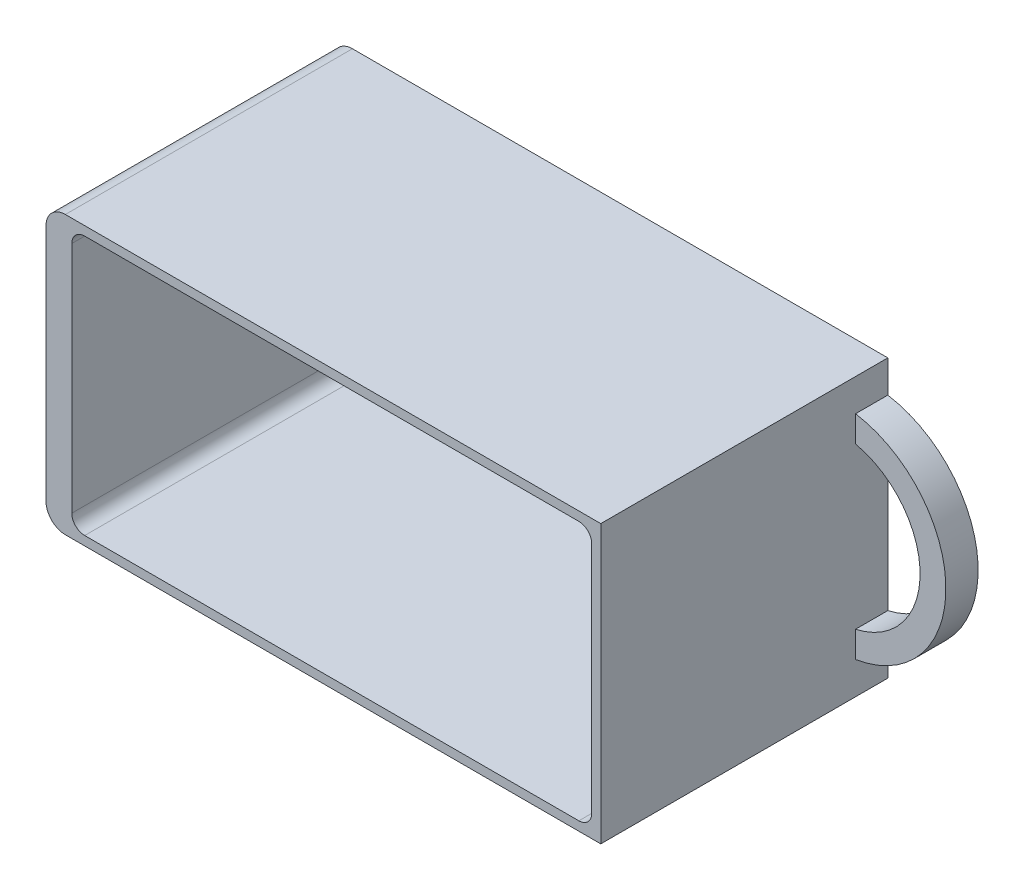
ISO-10303-21;
HEADER;
FILE_DESCRIPTION(('STEP AP214'),'2;1');
FILE_NAME('part.step','',(''),(''),'','','');
FILE_SCHEMA(('AUTOMOTIVE_DESIGN { 1 0 10303 214 1 1 1 1 }'));
ENDSEC;
DATA;
#1=APPLICATION_CONTEXT('core data for automotive mechanical design processes');
#2=APPLICATION_PROTOCOL_DEFINITION('international standard','automotive_design',2000,#1);
#3=PRODUCT_CONTEXT('',#1,'mechanical');
#4=PRODUCT('Part','Part','',(#3));
#5=PRODUCT_RELATED_PRODUCT_CATEGORY('part','',(#4));
#6=PRODUCT_DEFINITION_FORMATION('','',#4);
#7=PRODUCT_DEFINITION_CONTEXT('part definition',#1,'design');
#8=PRODUCT_DEFINITION('design','',#6,#7);
#9=PRODUCT_DEFINITION_SHAPE('','',#8);
#10=(LENGTH_UNIT() NAMED_UNIT(*) SI_UNIT(.MILLI.,.METRE.));
#11=(NAMED_UNIT(*) PLANE_ANGLE_UNIT() SI_UNIT($,.RADIAN.));
#12=(NAMED_UNIT(*) SI_UNIT($,.STERADIAN.) SOLID_ANGLE_UNIT());
#13=UNCERTAINTY_MEASURE_WITH_UNIT(LENGTH_MEASURE(1.E-05),#10,'distance_accuracy_value','');
#14=(GEOMETRIC_REPRESENTATION_CONTEXT(3) GLOBAL_UNCERTAINTY_ASSIGNED_CONTEXT((#13)) GLOBAL_UNIT_ASSIGNED_CONTEXT((#10,
#11,#12)) REPRESENTATION_CONTEXT('',''));
#15=CARTESIAN_POINT('',(0.,0.,0.));
#16=DIRECTION('',(0.,0.,1.));
#17=DIRECTION('',(1.,0.,0.));
#18=AXIS2_PLACEMENT_3D('',#15,#16,#17);
#19=CARTESIAN_POINT('',(4.,-21.5,-17.25));
#20=DIRECTION('',(0.,-1.,0.));
#21=DIRECTION('',(0.,0.,-1.));
#22=AXIS2_PLACEMENT_3D('',#19,#20,#21);
#23=PLANE('',#22);
#24=DIRECTION('',(1.,0.,0.));
#25=VECTOR('',#24,1.);
#26=CARTESIAN_POINT('',(4.,-21.5,22.25));
#27=LINE('',#26,#25);
#28=CARTESIAN_POINT('',(7.,-21.5,22.25));
#29=VERTEX_POINT('',#28);
#30=CARTESIAN_POINT('',(90.,-21.5,22.25));
#31=VERTEX_POINT('',#30);
#32=EDGE_CURVE('E221',#29,#31,#27,.T.);
#33=ORIENTED_EDGE('',*,*,#32,.F.);
#34=DIRECTION('',(0.,0.,1.));
#35=VECTOR('',#34,1.);
#36=CARTESIAN_POINT('',(7.,-21.5,-17.25));
#37=LINE('',#36,#35);
#38=CARTESIAN_POINT('',(7.,-21.5,-22.25));
#39=VERTEX_POINT('',#38);
#40=EDGE_CURVE('E249',#29,#39,#37,.F.);
#41=ORIENTED_EDGE('',*,*,#40,.T.);
#42=DIRECTION('',(-1.,0.,0.));
#43=VECTOR('',#42,1.);
#44=CARTESIAN_POINT('',(4.,-21.5,-22.25));
#45=LINE('',#44,#43);
#46=CARTESIAN_POINT('',(90.0000000000001,-21.5,-22.25));
#47=VERTEX_POINT('',#46);
#48=EDGE_CURVE('E199',#47,#39,#45,.T.);
#49=ORIENTED_EDGE('',*,*,#48,.F.);
#50=DIRECTION('',(0.,0.,1.));
#51=VECTOR('',#50,1.);
#52=CARTESIAN_POINT('',(90.,-21.5,-17.25));
#53=LINE('',#52,#51);
#54=EDGE_CURVE('E238',#47,#31,#53,.T.);
#55=ORIENTED_EDGE('',*,*,#54,.T.);
#56=EDGE_LOOP('',(#33,#41,#49,#55));
#57=FACE_BOUND('',#56,.T.);
#58=ADVANCED_FACE('F34',(#57),#23,.T.);
#59=CARTESIAN_POINT('',(4.,21.5,-17.25));
#60=DIRECTION('',(-1.,0.,0.));
#61=DIRECTION('',(0.,0.,1.));
#62=AXIS2_PLACEMENT_3D('',#59,#60,#61);
#63=PLANE('',#62);
#64=DIRECTION('',(0.,1.,0.));
#65=VECTOR('',#64,1.);
#66=CARTESIAN_POINT('',(4.,21.5,-22.25));
#67=LINE('',#66,#65);
#68=CARTESIAN_POINT('',(4.,-18.5,-22.25));
#69=VERTEX_POINT('',#68);
#70=CARTESIAN_POINT('',(4.,18.5,-22.25));
#71=VERTEX_POINT('',#70);
#72=EDGE_CURVE('E202',#69,#71,#67,.T.);
#73=ORIENTED_EDGE('',*,*,#72,.F.);
#74=DIRECTION('',(0.,0.,1.));
#75=VECTOR('',#74,1.);
#76=CARTESIAN_POINT('',(4.,-18.5,-17.25));
#77=LINE('',#76,#75);
#78=CARTESIAN_POINT('',(4.,-18.5,22.25));
#79=VERTEX_POINT('',#78);
#80=EDGE_CURVE('E242',#69,#79,#77,.T.);
#81=ORIENTED_EDGE('',*,*,#80,.T.);
#82=DIRECTION('',(0.,-1.,0.));
#83=VECTOR('',#82,1.);
#84=CARTESIAN_POINT('',(4.,21.5,22.25));
#85=LINE('',#84,#83);
#86=CARTESIAN_POINT('',(4.,18.5,22.25));
#87=VERTEX_POINT('',#86);
#88=EDGE_CURVE('E225',#87,#79,#85,.T.);
#89=ORIENTED_EDGE('',*,*,#88,.F.);
#90=DIRECTION('',(0.,0.,1.));
#91=VECTOR('',#90,1.);
#92=CARTESIAN_POINT('',(4.,18.5,-17.25));
#93=LINE('',#92,#91);
#94=EDGE_CURVE('E237',#87,#71,#93,.F.);
#95=ORIENTED_EDGE('',*,*,#94,.T.);
#96=EDGE_LOOP('',(#73,#81,#89,#95));
#97=FACE_BOUND('',#96,.T.);
#98=ADVANCED_FACE('F379',(#97),#63,.T.);
#99=CARTESIAN_POINT('',(90.,21.5,-17.25));
#100=DIRECTION('',(0.,1.,0.));
#101=DIRECTION('',(0.,0.,1.));
#102=AXIS2_PLACEMENT_3D('',#99,#100,#101);
#103=PLANE('',#102);
#104=DIRECTION('',(1.,0.,0.));
#105=VECTOR('',#104,1.);
#106=CARTESIAN_POINT('',(90.,21.5,-22.25));
#107=LINE('',#106,#105);
#108=CARTESIAN_POINT('',(7.00000000000001,21.5,-22.25));
#109=VERTEX_POINT('',#108);
#110=CARTESIAN_POINT('',(90.,21.5,-22.25));
#111=VERTEX_POINT('',#110);
#112=EDGE_CURVE('E205',#109,#111,#107,.T.);
#113=ORIENTED_EDGE('',*,*,#112,.F.);
#114=DIRECTION('',(0.,0.,1.));
#115=VECTOR('',#114,1.);
#116=CARTESIAN_POINT('',(7.00000000000001,21.5,-17.25));
#117=LINE('',#116,#115);
#118=CARTESIAN_POINT('',(7.00000000000001,21.5,22.25));
#119=VERTEX_POINT('',#118);
#120=EDGE_CURVE('E255',#109,#119,#117,.T.);
#121=ORIENTED_EDGE('',*,*,#120,.T.);
#122=DIRECTION('',(-1.,0.,0.));
#123=VECTOR('',#122,1.);
#124=CARTESIAN_POINT('',(90.,21.5,22.25));
#125=LINE('',#124,#123);
#126=CARTESIAN_POINT('',(90.,21.5,22.25));
#127=VERTEX_POINT('',#126);
#128=EDGE_CURVE('E230',#127,#119,#125,.T.);
#129=ORIENTED_EDGE('',*,*,#128,.F.);
#130=DIRECTION('',(0.,0.,1.));
#131=VECTOR('',#130,1.);
#132=CARTESIAN_POINT('',(90.,21.5,-17.25));
#133=LINE('',#132,#131);
#134=EDGE_CURVE('E235',#111,#127,#133,.T.);
#135=ORIENTED_EDGE('',*,*,#134,.F.);
#136=EDGE_LOOP('',(#113,#121,#129,#135));
#137=FACE_BOUND('',#136,.T.);
#138=ADVANCED_FACE('F385',(#137),#103,.T.);
#139=CARTESIAN_POINT('',(90.,-21.5,-17.25));
#140=DIRECTION('',(1.,0.,0.));
#141=DIRECTION('',(0.,0.,-1.));
#142=AXIS2_PLACEMENT_3D('',#139,#140,#141);
#143=PLANE('',#142);
#144=DIRECTION('',(0.,1.,0.));
#145=VECTOR('',#144,1.);
#146=CARTESIAN_POINT('',(90.,-21.5,22.25));
#147=LINE('',#146,#145);
#148=EDGE_CURVE('E227',#31,#127,#147,.T.);
#149=ORIENTED_EDGE('',*,*,#148,.F.);
#150=ORIENTED_EDGE('',*,*,#54,.F.);
#151=DIRECTION('',(0.,-1.,0.));
#152=VECTOR('',#151,1.);
#153=CARTESIAN_POINT('',(90.0000000000001,-21.5,-22.25));
#154=LINE('',#153,#152);
#155=CARTESIAN_POINT('',(90.0000000000001,-16.5000000000007,-22.25));
#156=VERTEX_POINT('',#155);
#157=EDGE_CURVE('E211',#156,#47,#154,.T.);
#158=ORIENTED_EDGE('',*,*,#157,.F.);
#159=DIRECTION('',(0.,0.,1.));
#160=VECTOR('',#159,1.);
#161=CARTESIAN_POINT('',(90.0000000000001,-16.5000000000007,-22.25));
#162=LINE('',#161,#160);
#163=CARTESIAN_POINT('',(90.0000000000001,-16.5000000000007,-17.25));
#164=VERTEX_POINT('',#163);
#165=EDGE_CURVE('E214',#156,#164,#162,.T.);
#166=ORIENTED_EDGE('',*,*,#165,.T.);
#167=DIRECTION('',(0.,1.,0.));
#168=VECTOR('',#167,1.);
#169=CARTESIAN_POINT('',(90.,-21.5,-17.25));
#170=LINE('',#169,#168);
#171=CARTESIAN_POINT('',(90.,-12.4283661723616,-17.25));
#172=VERTEX_POINT('',#171);
#173=EDGE_CURVE('E224',#164,#172,#170,.T.);
#174=ORIENTED_EDGE('',*,*,#173,.T.);
#175=DIRECTION('',(0.,0.,1.));
#176=VECTOR('',#175,1.);
#177=CARTESIAN_POINT('',(90.,-12.4283661723616,-22.25));
#178=LINE('',#177,#176);
#179=CARTESIAN_POINT('',(90.,-12.4283661723616,-22.25));
#180=VERTEX_POINT('',#179);
#181=EDGE_CURVE('E178',#180,#172,#178,.T.);
#182=ORIENTED_EDGE('',*,*,#181,.F.);
#183=DIRECTION('',(0.,1.,0.));
#184=VECTOR('',#183,1.);
#185=CARTESIAN_POINT('',(90.,-12.4283661723616,-22.25));
#186=LINE('',#185,#184);
#187=CARTESIAN_POINT('',(90.,12.4283661723609,-22.25));
#188=VERTEX_POINT('',#187);
#189=EDGE_CURVE('E171',#180,#188,#186,.T.);
#190=ORIENTED_EDGE('',*,*,#189,.T.);
#191=DIRECTION('',(0.,0.,1.));
#192=VECTOR('',#191,1.);
#193=CARTESIAN_POINT('',(90.,12.4283661723609,-22.25));
#194=LINE('',#193,#192);
#195=CARTESIAN_POINT('',(90.,12.4283661723609,-17.25));
#196=VERTEX_POINT('',#195);
#197=EDGE_CURVE('E176',#188,#196,#194,.T.);
#198=ORIENTED_EDGE('',*,*,#197,.T.);
#199=CARTESIAN_POINT('',(90.,16.5,-17.25));
#200=VERTEX_POINT('',#199);
#201=EDGE_CURVE('E222',#196,#200,#170,.T.);
#202=ORIENTED_EDGE('',*,*,#201,.T.);
#203=DIRECTION('',(0.,0.,1.));
#204=VECTOR('',#203,1.);
#205=CARTESIAN_POINT('',(90.,16.5,-22.25));
#206=LINE('',#205,#204);
#207=CARTESIAN_POINT('',(90.,16.5,-22.25));
#208=VERTEX_POINT('',#207);
#209=EDGE_CURVE('E219',#208,#200,#206,.T.);
#210=ORIENTED_EDGE('',*,*,#209,.F.);
#211=DIRECTION('',(0.,-1.,0.));
#212=VECTOR('',#211,1.);
#213=CARTESIAN_POINT('',(90.,16.5,-22.25));
#214=LINE('',#213,#212);
#215=EDGE_CURVE('E207',#111,#208,#214,.T.);
#216=ORIENTED_EDGE('',*,*,#215,.F.);
#217=ORIENTED_EDGE('',*,*,#134,.T.);
#218=EDGE_LOOP('',(#149,#150,#158,#166,#174,#182,#190,#198,#202,#210,#216,#217));
#219=FACE_BOUND('',#218,.T.);
#220=ADVANCED_FACE('F174',(#219),#143,.T.);
#221=CARTESIAN_POINT('',(0.,0.,22.25));
#222=DIRECTION('',(0.,0.,1.));
#223=DIRECTION('',(1.,0.,0.));
#224=AXIS2_PLACEMENT_3D('',#221,#222,#223);
#225=PLANE('',#224);
#226=DIRECTION('',(1.,0.,0.));
#227=VECTOR('',#226,1.);
#228=CARTESIAN_POINT('',(8.,-20.1,22.25));
#229=LINE('',#228,#227);
#230=CARTESIAN_POINT('',(10.,-20.1,22.25));
#231=VERTEX_POINT('',#230);
#232=CARTESIAN_POINT('',(86.6,-20.1,22.25));
#233=VERTEX_POINT('',#232);
#234=EDGE_CURVE('E329',#231,#233,#229,.T.);
#235=ORIENTED_EDGE('',*,*,#234,.F.);
#236=CARTESIAN_POINT('',(10.,-18.1,22.25));
#237=DIRECTION('',(0.,0.,1.));
#238=DIRECTION('',(1.,0.,0.));
#239=AXIS2_PLACEMENT_3D('',#236,#237,#238);
#240=CIRCLE('',#239,2.);
#241=CARTESIAN_POINT('',(8.,-18.1,22.25));
#242=VERTEX_POINT('',#241);
#243=EDGE_CURVE('E43',#231,#242,#240,.F.);
#244=ORIENTED_EDGE('',*,*,#243,.T.);
#245=DIRECTION('',(0.,-1.,0.));
#246=VECTOR('',#245,1.);
#247=CARTESIAN_POINT('',(8.,20.1,22.25));
#248=LINE('',#247,#246);
#249=CARTESIAN_POINT('',(8.,18.1,22.25));
#250=VERTEX_POINT('',#249);
#251=EDGE_CURVE('E192',#250,#242,#248,.T.);
#252=ORIENTED_EDGE('',*,*,#251,.F.);
#253=CARTESIAN_POINT('',(10.,18.1,22.25));
#254=DIRECTION('',(0.,0.,1.));
#255=DIRECTION('',(1.,0.,0.));
#256=AXIS2_PLACEMENT_3D('',#253,#254,#255);
#257=CIRCLE('',#256,2.);
#258=CARTESIAN_POINT('',(10.,20.1,22.25));
#259=VERTEX_POINT('',#258);
#260=EDGE_CURVE('E11',#250,#259,#257,.F.);
#261=ORIENTED_EDGE('',*,*,#260,.T.);
#262=DIRECTION('',(-1.,0.,0.));
#263=VECTOR('',#262,1.);
#264=CARTESIAN_POINT('',(88.6,20.1,22.25));
#265=LINE('',#264,#263);
#266=CARTESIAN_POINT('',(86.6,20.1,22.25));
#267=VERTEX_POINT('',#266);
#268=EDGE_CURVE('E340',#267,#259,#265,.T.);
#269=ORIENTED_EDGE('',*,*,#268,.F.);
#270=CARTESIAN_POINT('',(86.6,18.1,22.25));
#271=DIRECTION('',(0.,0.,1.));
#272=DIRECTION('',(1.,0.,0.));
#273=AXIS2_PLACEMENT_3D('',#270,#271,#272);
#274=CIRCLE('',#273,2.);
#275=CARTESIAN_POINT('',(88.6,18.1,22.25));
#276=VERTEX_POINT('',#275);
#277=EDGE_CURVE('E292',#267,#276,#274,.F.);
#278=ORIENTED_EDGE('',*,*,#277,.T.);
#279=DIRECTION('',(0.,1.,0.));
#280=VECTOR('',#279,1.);
#281=CARTESIAN_POINT('',(88.6,-20.1,22.25));
#282=LINE('',#281,#280);
#283=CARTESIAN_POINT('',(88.6,-18.1,22.25));
#284=VERTEX_POINT('',#283);
#285=EDGE_CURVE('E334',#284,#276,#282,.T.);
#286=ORIENTED_EDGE('',*,*,#285,.F.);
#287=CARTESIAN_POINT('',(86.6,-18.1,22.25));
#288=DIRECTION('',(0.,0.,1.));
#289=DIRECTION('',(1.,0.,0.));
#290=AXIS2_PLACEMENT_3D('',#287,#288,#289);
#291=CIRCLE('',#290,2.);
#292=EDGE_CURVE('E290',#284,#233,#291,.F.);
#293=ORIENTED_EDGE('',*,*,#292,.T.);
#294=EDGE_LOOP('',(#235,#244,#252,#261,#269,#278,#286,#293));
#295=FACE_BOUND('',#294,.T.);
#296=ORIENTED_EDGE('',*,*,#88,.T.);
#297=CARTESIAN_POINT('',(7.,-18.5,22.25));
#298=DIRECTION('',(0.,0.,1.));
#299=DIRECTION('',(1.,0.,0.));
#300=AXIS2_PLACEMENT_3D('',#297,#298,#299);
#301=CIRCLE('',#300,3.);
#302=EDGE_CURVE('E247',#79,#29,#301,.T.);
#303=ORIENTED_EDGE('',*,*,#302,.T.);
#304=ORIENTED_EDGE('',*,*,#32,.T.);
#305=ORIENTED_EDGE('',*,*,#148,.T.);
#306=ORIENTED_EDGE('',*,*,#128,.T.);
#307=CARTESIAN_POINT('',(7.00000000000001,18.5,22.25));
#308=DIRECTION('',(0.,0.,1.));
#309=DIRECTION('',(1.,0.,0.));
#310=AXIS2_PLACEMENT_3D('',#307,#308,#309);
#311=CIRCLE('',#310,3.);
#312=EDGE_CURVE('E245',#119,#87,#311,.T.);
#313=ORIENTED_EDGE('',*,*,#312,.T.);
#314=EDGE_LOOP('',(#296,#303,#304,#305,#306,#313));
#315=FACE_BOUND('',#314,.T.);
#316=ADVANCED_FACE('F590',(#295,#315),#225,.T.);
#317=CARTESIAN_POINT('',(87.2767857142857,-3.40358276748094E-13,-17.25));
#318=DIRECTION('',(0.,0.,1.));
#319=DIRECTION('',(1.,0.,0.));
#320=AXIS2_PLACEMENT_3D('',#317,#318,#319);
#321=PLANE('',#320);
#322=ORIENTED_EDGE('',*,*,#173,.F.);
#323=CARTESIAN_POINT('',(87.2767857142857,-3.40358276748094E-13,-17.25));
#324=DIRECTION('',(0.,0.,-1.));
#325=DIRECTION('',(1.,0.,0.));
#326=AXIS2_PLACEMENT_3D('',#323,#324,#325);
#327=CIRCLE('',#326,16.7232142857146);
#328=EDGE_CURVE('E198',#200,#164,#327,.T.);
#329=ORIENTED_EDGE('',*,*,#328,.F.);
#330=ORIENTED_EDGE('',*,*,#201,.F.);
#331=CARTESIAN_POINT('',(87.2767857142857,-3.40358276748094E-13,-17.25));
#332=DIRECTION('',(0.,0.,-1.));
#333=DIRECTION('',(-1.,0.,0.));
#334=AXIS2_PLACEMENT_3D('',#331,#332,#333);
#335=CIRCLE('',#334,12.7232142857146);
#336=EDGE_CURVE('E188',#196,#172,#335,.T.);
#337=ORIENTED_EDGE('',*,*,#336,.T.);
#338=EDGE_LOOP('',(#322,#329,#330,#337));
#339=FACE_BOUND('',#338,.T.);
#340=ADVANCED_FACE('F581',(#339),#321,.T.);
#341=CARTESIAN_POINT('',(87.2767857142857,-3.40358276748094E-13,-22.25));
#342=DIRECTION('',(0.,0.,1.));
#343=DIRECTION('',(1.,0.,0.));
#344=AXIS2_PLACEMENT_3D('',#341,#342,#343);
#345=PLANE('',#344);
#346=ORIENTED_EDGE('',*,*,#48,.T.);
#347=CARTESIAN_POINT('',(7.,-18.5,-22.25));
#348=DIRECTION('',(0.,0.,1.));
#349=DIRECTION('',(1.,0.,0.));
#350=AXIS2_PLACEMENT_3D('',#347,#348,#349);
#351=CIRCLE('',#350,3.);
#352=EDGE_CURVE('E253',#39,#69,#351,.F.);
#353=ORIENTED_EDGE('',*,*,#352,.T.);
#354=ORIENTED_EDGE('',*,*,#72,.T.);
#355=CARTESIAN_POINT('',(7.00000000000001,18.5,-22.25));
#356=DIRECTION('',(0.,0.,1.));
#357=DIRECTION('',(1.,0.,0.));
#358=AXIS2_PLACEMENT_3D('',#355,#356,#357);
#359=CIRCLE('',#358,3.);
#360=EDGE_CURVE('E251',#71,#109,#359,.F.);
#361=ORIENTED_EDGE('',*,*,#360,.T.);
#362=ORIENTED_EDGE('',*,*,#112,.T.);
#363=ORIENTED_EDGE('',*,*,#215,.T.);
#364=CARTESIAN_POINT('',(87.2767857142857,-3.40358276748094E-13,-22.25));
#365=DIRECTION('',(0.,0.,-1.));
#366=DIRECTION('',(1.,0.,0.));
#367=AXIS2_PLACEMENT_3D('',#364,#365,#366);
#368=CIRCLE('',#367,16.7232142857146);
#369=EDGE_CURVE('E209',#208,#156,#368,.T.);
#370=ORIENTED_EDGE('',*,*,#369,.T.);
#371=ORIENTED_EDGE('',*,*,#157,.T.);
#372=EDGE_LOOP('',(#346,#353,#354,#361,#362,#363,#370,#371));
#373=FACE_BOUND('',#372,.T.);
#374=CARTESIAN_POINT('',(87.2767857142857,-3.40358276748094E-13,-22.25));
#375=DIRECTION('',(0.,0.,-1.));
#376=DIRECTION('',(-1.,0.,0.));
#377=AXIS2_PLACEMENT_3D('',#374,#375,#376);
#378=CIRCLE('',#377,12.7232142857146);
#379=EDGE_CURVE('E182',#188,#180,#378,.T.);
#380=ORIENTED_EDGE('',*,*,#379,.F.);
#381=ORIENTED_EDGE('',*,*,#189,.F.);
#382=EDGE_LOOP('',(#380,#381));
#383=FACE_BOUND('',#382,.T.);
#384=ADVANCED_FACE('F190',(#373,#383),#345,.F.);
#385=CARTESIAN_POINT('',(87.2767857142857,-3.40358276748094E-13,-22.25));
#386=DIRECTION('',(0.,0.,1.));
#387=DIRECTION('',(1.,0.,0.));
#388=AXIS2_PLACEMENT_3D('',#385,#386,#387);
#389=CYLINDRICAL_SURFACE('',#388,16.7232142857146);
#390=ORIENTED_EDGE('',*,*,#328,.T.);
#391=ORIENTED_EDGE('',*,*,#165,.F.);
#392=ORIENTED_EDGE('',*,*,#369,.F.);
#393=ORIENTED_EDGE('',*,*,#209,.T.);
#394=EDGE_LOOP('',(#390,#391,#392,#393));
#395=FACE_BOUND('',#394,.T.);
#396=ADVANCED_FACE('F565',(#395),#389,.T.);
#397=CARTESIAN_POINT('',(87.2767857142857,-3.40358276748094E-13,-22.25));
#398=DIRECTION('',(0.,0.,1.));
#399=DIRECTION('',(1.,0.,0.));
#400=AXIS2_PLACEMENT_3D('',#397,#398,#399);
#401=CYLINDRICAL_SURFACE('',#400,12.7232142857146);
#402=ORIENTED_EDGE('',*,*,#336,.F.);
#403=ORIENTED_EDGE('',*,*,#197,.F.);
#404=ORIENTED_EDGE('',*,*,#379,.T.);
#405=ORIENTED_EDGE('',*,*,#181,.T.);
#406=EDGE_LOOP('',(#402,#403,#404,#405));
#407=FACE_BOUND('',#406,.T.);
#408=ADVANCED_FACE('F186',(#407),#401,.F.);
#409=CARTESIAN_POINT('',(8.,-20.1,-21.35));
#410=DIRECTION('',(0.,-1.,0.));
#411=DIRECTION('',(1.,0.,0.));
#412=AXIS2_PLACEMENT_3D('',#409,#410,#411);
#413=PLANE('',#412);
#414=ORIENTED_EDGE('',*,*,#234,.T.);
#415=DIRECTION('',(0.,0.,1.));
#416=VECTOR('',#415,1.);
#417=CARTESIAN_POINT('',(86.6,-20.1,-21.35));
#418=LINE('',#417,#416);
#419=CARTESIAN_POINT('',(86.6,-20.1,-19.35));
#420=VERTEX_POINT('',#419);
#421=EDGE_CURVE('E269',#233,#420,#418,.F.);
#422=ORIENTED_EDGE('',*,*,#421,.T.);
#423=DIRECTION('',(1.,0.,0.));
#424=VECTOR('',#423,1.);
#425=CARTESIAN_POINT('',(8.,-20.1,-19.35));
#426=LINE('',#425,#424);
#427=CARTESIAN_POINT('',(10.,-20.1,-19.35));
#428=VERTEX_POINT('',#427);
#429=EDGE_CURVE('E267',#420,#428,#426,.F.);
#430=ORIENTED_EDGE('',*,*,#429,.T.);
#431=DIRECTION('',(0.,0.,1.));
#432=VECTOR('',#431,1.);
#433=CARTESIAN_POINT('',(10.,-20.1,22.25));
#434=LINE('',#433,#432);
#435=EDGE_CURVE('E265',#428,#231,#434,.T.);
#436=ORIENTED_EDGE('',*,*,#435,.T.);
#437=EDGE_LOOP('',(#414,#422,#430,#436));
#438=FACE_BOUND('',#437,.T.);
#439=ADVANCED_FACE('F550',(#438),#413,.F.);
#440=CARTESIAN_POINT('',(8.,20.1,-21.35));
#441=DIRECTION('',(-1.,0.,0.));
#442=DIRECTION('',(0.,-1.,0.));
#443=AXIS2_PLACEMENT_3D('',#440,#441,#442);
#444=PLANE('',#443);
#445=ORIENTED_EDGE('',*,*,#251,.T.);
#446=DIRECTION('',(0.,0.,1.));
#447=VECTOR('',#446,1.);
#448=CARTESIAN_POINT('',(8.,-18.1,-21.35));
#449=LINE('',#448,#447);
#450=CARTESIAN_POINT('',(8.,-18.1,-19.35));
#451=VERTEX_POINT('',#450);
#452=EDGE_CURVE('E56',#242,#451,#449,.F.);
#453=ORIENTED_EDGE('',*,*,#452,.T.);
#454=DIRECTION('',(0.,-1.,0.));
#455=VECTOR('',#454,1.);
#456=CARTESIAN_POINT('',(8.,20.1,-19.35));
#457=LINE('',#456,#455);
#458=CARTESIAN_POINT('',(8.,18.1,-19.35));
#459=VERTEX_POINT('',#458);
#460=EDGE_CURVE('E51',#451,#459,#457,.F.);
#461=ORIENTED_EDGE('',*,*,#460,.T.);
#462=DIRECTION('',(0.,0.,1.));
#463=VECTOR('',#462,1.);
#464=CARTESIAN_POINT('',(8.,18.1,22.25));
#465=LINE('',#464,#463);
#466=EDGE_CURVE('E287',#459,#250,#465,.T.);
#467=ORIENTED_EDGE('',*,*,#466,.T.);
#468=EDGE_LOOP('',(#445,#453,#461,#467));
#469=FACE_BOUND('',#468,.T.);
#470=ADVANCED_FACE('F347',(#469),#444,.F.);
#471=CARTESIAN_POINT('',(88.6,20.1,-21.35));
#472=DIRECTION('',(0.,1.,0.));
#473=DIRECTION('',(0.,0.,1.));
#474=AXIS2_PLACEMENT_3D('',#471,#472,#473);
#475=PLANE('',#474);
#476=DIRECTION('',(-1.,0.,0.));
#477=VECTOR('',#476,1.);
#478=CARTESIAN_POINT('',(88.6,20.1,-19.35));
#479=LINE('',#478,#477);
#480=CARTESIAN_POINT('',(10.,20.1,-19.35));
#481=VERTEX_POINT('',#480);
#482=CARTESIAN_POINT('',(86.6,20.1,-19.35));
#483=VERTEX_POINT('',#482);
#484=EDGE_CURVE('E271',#481,#483,#479,.F.);
#485=ORIENTED_EDGE('',*,*,#484,.T.);
#486=DIRECTION('',(0.,0.,1.));
#487=VECTOR('',#486,1.);
#488=CARTESIAN_POINT('',(86.6,20.1,22.25));
#489=LINE('',#488,#487);
#490=EDGE_CURVE('E275',#483,#267,#489,.T.);
#491=ORIENTED_EDGE('',*,*,#490,.T.);
#492=ORIENTED_EDGE('',*,*,#268,.T.);
#493=DIRECTION('',(0.,0.,1.));
#494=VECTOR('',#493,1.);
#495=CARTESIAN_POINT('',(10.,20.1,-21.35));
#496=LINE('',#495,#494);
#497=EDGE_CURVE('E273',#259,#481,#496,.F.);
#498=ORIENTED_EDGE('',*,*,#497,.T.);
#499=EDGE_LOOP('',(#485,#491,#492,#498));
#500=FACE_BOUND('',#499,.T.);
#501=ADVANCED_FACE('F534',(#500),#475,.F.);
#502=CARTESIAN_POINT('',(88.6,-20.1,-21.35));
#503=DIRECTION('',(1.,0.,0.));
#504=DIRECTION('',(0.,1.,0.));
#505=AXIS2_PLACEMENT_3D('',#502,#503,#504);
#506=PLANE('',#505);
#507=DIRECTION('',(0.,1.,0.));
#508=VECTOR('',#507,1.);
#509=CARTESIAN_POINT('',(88.6,-20.1,-19.35));
#510=LINE('',#509,#508);
#511=CARTESIAN_POINT('',(88.6,18.1,-19.35));
#512=VERTEX_POINT('',#511);
#513=CARTESIAN_POINT('',(88.6,-18.1,-19.35));
#514=VERTEX_POINT('',#513);
#515=EDGE_CURVE('E258',#512,#514,#510,.F.);
#516=ORIENTED_EDGE('',*,*,#515,.T.);
#517=DIRECTION('',(0.,0.,1.));
#518=VECTOR('',#517,1.);
#519=CARTESIAN_POINT('',(88.6,-18.1,22.25));
#520=LINE('',#519,#518);
#521=EDGE_CURVE('E262',#514,#284,#520,.T.);
#522=ORIENTED_EDGE('',*,*,#521,.T.);
#523=ORIENTED_EDGE('',*,*,#285,.T.);
#524=DIRECTION('',(0.,0.,1.));
#525=VECTOR('',#524,1.);
#526=CARTESIAN_POINT('',(88.6,18.1,-21.35));
#527=LINE('',#526,#525);
#528=EDGE_CURVE('E260',#276,#512,#527,.F.);
#529=ORIENTED_EDGE('',*,*,#528,.T.);
#530=EDGE_LOOP('',(#516,#522,#523,#529));
#531=FACE_BOUND('',#530,.T.);
#532=ADVANCED_FACE('F526',(#531),#506,.F.);
#533=CARTESIAN_POINT('',(0.,0.,-21.35));
#534=DIRECTION('',(0.,0.,1.));
#535=DIRECTION('',(1.,0.,0.));
#536=AXIS2_PLACEMENT_3D('',#533,#534,#535);
#537=PLANE('',#536);
#538=DIRECTION('',(1.,0.,0.));
#539=VECTOR('',#538,1.);
#540=CARTESIAN_POINT('',(0.,-18.1,-21.35));
#541=LINE('',#540,#539);
#542=CARTESIAN_POINT('',(10.,-18.1,-21.35));
#543=VERTEX_POINT('',#542);
#544=CARTESIAN_POINT('',(86.6,-18.1,-21.35));
#545=VERTEX_POINT('',#544);
#546=EDGE_CURVE('E281',#543,#545,#541,.T.);
#547=ORIENTED_EDGE('',*,*,#546,.T.);
#548=DIRECTION('',(0.,1.,0.));
#549=VECTOR('',#548,1.);
#550=CARTESIAN_POINT('',(86.6,0.,-21.35));
#551=LINE('',#550,#549);
#552=CARTESIAN_POINT('',(86.6,18.1,-21.35));
#553=VERTEX_POINT('',#552);
#554=EDGE_CURVE('E283',#545,#553,#551,.T.);
#555=ORIENTED_EDGE('',*,*,#554,.T.);
#556=DIRECTION('',(-1.,0.,0.));
#557=VECTOR('',#556,1.);
#558=CARTESIAN_POINT('',(0.,18.1,-21.35));
#559=LINE('',#558,#557);
#560=CARTESIAN_POINT('',(10.,18.1,-21.35));
#561=VERTEX_POINT('',#560);
#562=EDGE_CURVE('E279',#553,#561,#559,.T.);
#563=ORIENTED_EDGE('',*,*,#562,.T.);
#564=DIRECTION('',(0.,-1.,0.));
#565=VECTOR('',#564,1.);
#566=CARTESIAN_POINT('',(10.,0.,-21.35));
#567=LINE('',#566,#565);
#568=EDGE_CURVE('E277',#561,#543,#567,.T.);
#569=ORIENTED_EDGE('',*,*,#568,.T.);
#570=EDGE_LOOP('',(#547,#555,#563,#569));
#571=FACE_BOUND('',#570,.T.);
#572=ADVANCED_FACE('F362',(#571),#537,.T.);
#573=CARTESIAN_POINT('',(7.,-18.5,-17.25));
#574=DIRECTION('',(0.,0.,1.));
#575=DIRECTION('',(1.,0.,0.));
#576=AXIS2_PLACEMENT_3D('',#573,#574,#575);
#577=CYLINDRICAL_SURFACE('',#576,3.);
#578=ORIENTED_EDGE('',*,*,#352,.F.);
#579=ORIENTED_EDGE('',*,*,#40,.F.);
#580=ORIENTED_EDGE('',*,*,#302,.F.);
#581=ORIENTED_EDGE('',*,*,#80,.F.);
#582=EDGE_LOOP('',(#578,#579,#580,#581));
#583=FACE_BOUND('',#582,.T.);
#584=ADVANCED_FACE('F392',(#583),#577,.T.);
#585=CARTESIAN_POINT('',(7.00000000000001,18.5,-17.25));
#586=DIRECTION('',(0.,0.,1.));
#587=DIRECTION('',(1.,0.,0.));
#588=AXIS2_PLACEMENT_3D('',#585,#586,#587);
#589=CYLINDRICAL_SURFACE('',#588,3.);
#590=ORIENTED_EDGE('',*,*,#360,.F.);
#591=ORIENTED_EDGE('',*,*,#94,.F.);
#592=ORIENTED_EDGE('',*,*,#312,.F.);
#593=ORIENTED_EDGE('',*,*,#120,.F.);
#594=EDGE_LOOP('',(#590,#591,#592,#593));
#595=FACE_BOUND('',#594,.T.);
#596=ADVANCED_FACE('F376',(#595),#589,.T.);
#597=CARTESIAN_POINT('',(10.,18.1,-21.35));
#598=DIRECTION('',(0.,0.,-1.));
#599=DIRECTION('',(-1.,0.,0.));
#600=AXIS2_PLACEMENT_3D('',#597,#598,#599);
#601=CYLINDRICAL_SURFACE('',#600,2.);
#602=CARTESIAN_POINT('',(10.,18.1,-19.35));
#603=DIRECTION('',(0.,0.,1.));
#604=DIRECTION('',(1.,0.,0.));
#605=AXIS2_PLACEMENT_3D('',#602,#603,#604);
#606=CIRCLE('',#605,2.);
#607=EDGE_CURVE('E38',#481,#459,#606,.T.);
#608=ORIENTED_EDGE('',*,*,#607,.F.);
#609=ORIENTED_EDGE('',*,*,#497,.F.);
#610=ORIENTED_EDGE('',*,*,#260,.F.);
#611=ORIENTED_EDGE('',*,*,#466,.F.);
#612=EDGE_LOOP('',(#608,#609,#610,#611));
#613=FACE_BOUND('',#612,.T.);
#614=ADVANCED_FACE('F36',(#613),#601,.F.);
#615=CARTESIAN_POINT('',(10.,18.1,-19.35));
#616=DIRECTION('',(0.,0.,1.));
#617=DIRECTION('',(1.,0.,0.));
#618=AXIS2_PLACEMENT_3D('',#615,#616,#617);
#619=SPHERICAL_SURFACE('',#618,2.);
#620=CARTESIAN_POINT('',(10.,18.1,-19.35));
#621=DIRECTION('',(1.,0.,0.));
#622=DIRECTION('',(0.,1.,0.));
#623=AXIS2_PLACEMENT_3D('',#620,#621,#622);
#624=CIRCLE('',#623,2.);
#625=EDGE_CURVE('E321',#481,#561,#624,.F.);
#626=ORIENTED_EDGE('',*,*,#625,.F.);
#627=ORIENTED_EDGE('',*,*,#607,.T.);
#628=CARTESIAN_POINT('',(10.,18.1,-19.35));
#629=DIRECTION('',(0.,-1.,0.));
#630=DIRECTION('',(0.,0.,-1.));
#631=AXIS2_PLACEMENT_3D('',#628,#629,#630);
#632=CIRCLE('',#631,2.);
#633=EDGE_CURVE('E323',#561,#459,#632,.F.);
#634=ORIENTED_EDGE('',*,*,#633,.F.);
#635=EDGE_LOOP('',(#626,#627,#634));
#636=FACE_BOUND('',#635,.T.);
#637=ADVANCED_FACE('F369',(#636),#619,.F.);
#638=CARTESIAN_POINT('',(10.,-18.1,-21.35));
#639=DIRECTION('',(0.,0.,-1.));
#640=DIRECTION('',(-1.,0.,0.));
#641=AXIS2_PLACEMENT_3D('',#638,#639,#640);
#642=CYLINDRICAL_SURFACE('',#641,2.);
#643=ORIENTED_EDGE('',*,*,#243,.F.);
#644=ORIENTED_EDGE('',*,*,#435,.F.);
#645=CARTESIAN_POINT('',(10.,-18.1,-19.35));
#646=DIRECTION('',(0.,0.,1.));
#647=DIRECTION('',(1.,0.,0.));
#648=AXIS2_PLACEMENT_3D('',#645,#646,#647);
#649=CIRCLE('',#648,2.);
#650=EDGE_CURVE('E318',#451,#428,#649,.T.);
#651=ORIENTED_EDGE('',*,*,#650,.F.);
#652=ORIENTED_EDGE('',*,*,#452,.F.);
#653=EDGE_LOOP('',(#643,#644,#651,#652));
#654=FACE_BOUND('',#653,.T.);
#655=ADVANCED_FACE('F353',(#654),#642,.F.);
#656=CARTESIAN_POINT('',(10.,0.,-19.35));
#657=DIRECTION('',(0.,-1.,0.));
#658=DIRECTION('',(1.,0.,0.));
#659=AXIS2_PLACEMENT_3D('',#656,#657,#658);
#660=CYLINDRICAL_SURFACE('',#659,2.);
#661=ORIENTED_EDGE('',*,*,#633,.T.);
#662=ORIENTED_EDGE('',*,*,#460,.F.);
#663=CARTESIAN_POINT('',(10.,-18.1,-19.35));
#664=DIRECTION('',(0.,1.,0.));
#665=DIRECTION('',(0.,0.,1.));
#666=AXIS2_PLACEMENT_3D('',#663,#664,#665);
#667=CIRCLE('',#666,2.);
#668=EDGE_CURVE('E315',#543,#451,#667,.T.);
#669=ORIENTED_EDGE('',*,*,#668,.F.);
#670=ORIENTED_EDGE('',*,*,#568,.F.);
#671=EDGE_LOOP('',(#661,#662,#669,#670));
#672=FACE_BOUND('',#671,.T.);
#673=ADVANCED_FACE('F360',(#672),#660,.F.);
#674=CARTESIAN_POINT('',(0.,18.1,-19.35));
#675=DIRECTION('',(-1.,0.,0.));
#676=DIRECTION('',(0.,0.,1.));
#677=AXIS2_PLACEMENT_3D('',#674,#675,#676);
#678=CYLINDRICAL_SURFACE('',#677,2.);
#679=ORIENTED_EDGE('',*,*,#625,.T.);
#680=ORIENTED_EDGE('',*,*,#562,.F.);
#681=CARTESIAN_POINT('',(86.6,18.1,-19.35));
#682=DIRECTION('',(-1.,0.,0.));
#683=DIRECTION('',(0.,0.,1.));
#684=AXIS2_PLACEMENT_3D('',#681,#682,#683);
#685=CIRCLE('',#684,2.);
#686=EDGE_CURVE('E312',#483,#553,#685,.T.);
#687=ORIENTED_EDGE('',*,*,#686,.F.);
#688=ORIENTED_EDGE('',*,*,#484,.F.);
#689=EDGE_LOOP('',(#679,#680,#687,#688));
#690=FACE_BOUND('',#689,.T.);
#691=ADVANCED_FACE('F368',(#690),#678,.F.);
#692=CARTESIAN_POINT('',(86.6,18.1,-21.35));
#693=DIRECTION('',(0.,0.,-1.));
#694=DIRECTION('',(-1.,0.,0.));
#695=AXIS2_PLACEMENT_3D('',#692,#693,#694);
#696=CYLINDRICAL_SURFACE('',#695,2.);
#697=ORIENTED_EDGE('',*,*,#277,.F.);
#698=ORIENTED_EDGE('',*,*,#490,.F.);
#699=CARTESIAN_POINT('',(86.6,18.1,-19.35));
#700=DIRECTION('',(0.,0.,1.));
#701=DIRECTION('',(1.,0.,0.));
#702=AXIS2_PLACEMENT_3D('',#699,#700,#701);
#703=CIRCLE('',#702,2.);
#704=EDGE_CURVE('E309',#512,#483,#703,.T.);
#705=ORIENTED_EDGE('',*,*,#704,.F.);
#706=ORIENTED_EDGE('',*,*,#528,.F.);
#707=EDGE_LOOP('',(#697,#698,#705,#706));
#708=FACE_BOUND('',#707,.T.);
#709=ADVANCED_FACE('F421',(#708),#696,.F.);
#710=CARTESIAN_POINT('',(10.,-18.1,-19.35));
#711=DIRECTION('',(0.,0.,1.));
#712=DIRECTION('',(1.,0.,0.));
#713=AXIS2_PLACEMENT_3D('',#710,#711,#712);
#714=SPHERICAL_SURFACE('',#713,2.);
#715=ORIENTED_EDGE('',*,*,#668,.T.);
#716=ORIENTED_EDGE('',*,*,#650,.T.);
#717=CARTESIAN_POINT('',(10.,-18.1,-19.35));
#718=DIRECTION('',(1.,0.,0.));
#719=DIRECTION('',(0.,0.,-1.));
#720=AXIS2_PLACEMENT_3D('',#717,#718,#719);
#721=CIRCLE('',#720,2.);
#722=EDGE_CURVE('E306',#543,#428,#721,.F.);
#723=ORIENTED_EDGE('',*,*,#722,.F.);
#724=EDGE_LOOP('',(#715,#716,#723));
#725=FACE_BOUND('',#724,.T.);
#726=ADVANCED_FACE('F358',(#725),#714,.F.);
#727=CARTESIAN_POINT('',(86.6,18.1,-19.35));
#728=DIRECTION('',(0.,0.,1.));
#729=DIRECTION('',(1.,0.,0.));
#730=AXIS2_PLACEMENT_3D('',#727,#728,#729);
#731=SPHERICAL_SURFACE('',#730,2.);
#732=ORIENTED_EDGE('',*,*,#704,.T.);
#733=ORIENTED_EDGE('',*,*,#686,.T.);
#734=CARTESIAN_POINT('',(86.6,18.1,-19.35));
#735=DIRECTION('',(0.,-1.,0.));
#736=DIRECTION('',(0.,0.,-1.));
#737=AXIS2_PLACEMENT_3D('',#734,#735,#736);
#738=CIRCLE('',#737,2.);
#739=EDGE_CURVE('E304',#512,#553,#738,.F.);
#740=ORIENTED_EDGE('',*,*,#739,.F.);
#741=EDGE_LOOP('',(#732,#733,#740));
#742=FACE_BOUND('',#741,.T.);
#743=ADVANCED_FACE('F414',(#742),#731,.F.);
#744=CARTESIAN_POINT('',(0.,-18.1,-19.35));
#745=DIRECTION('',(1.,0.,0.));
#746=DIRECTION('',(0.,1.,0.));
#747=AXIS2_PLACEMENT_3D('',#744,#745,#746);
#748=CYLINDRICAL_SURFACE('',#747,2.);
#749=ORIENTED_EDGE('',*,*,#722,.T.);
#750=ORIENTED_EDGE('',*,*,#429,.F.);
#751=CARTESIAN_POINT('',(86.6,-18.1,-19.35));
#752=DIRECTION('',(-1.,0.,0.));
#753=DIRECTION('',(0.,-1.,0.));
#754=AXIS2_PLACEMENT_3D('',#751,#752,#753);
#755=CIRCLE('',#754,2.);
#756=EDGE_CURVE('E301',#545,#420,#755,.T.);
#757=ORIENTED_EDGE('',*,*,#756,.F.);
#758=ORIENTED_EDGE('',*,*,#546,.F.);
#759=EDGE_LOOP('',(#749,#750,#757,#758));
#760=FACE_BOUND('',#759,.T.);
#761=ADVANCED_FACE('F410',(#760),#748,.F.);
#762=CARTESIAN_POINT('',(86.6,0.,-19.35));
#763=DIRECTION('',(0.,1.,0.));
#764=DIRECTION('',(-1.,0.,0.));
#765=AXIS2_PLACEMENT_3D('',#762,#763,#764);
#766=CYLINDRICAL_SURFACE('',#765,2.);
#767=ORIENTED_EDGE('',*,*,#739,.T.);
#768=ORIENTED_EDGE('',*,*,#554,.F.);
#769=CARTESIAN_POINT('',(86.6,-18.1,-19.35));
#770=DIRECTION('',(0.,1.,0.));
#771=DIRECTION('',(0.,0.,1.));
#772=AXIS2_PLACEMENT_3D('',#769,#770,#771);
#773=CIRCLE('',#772,2.);
#774=EDGE_CURVE('E298',#514,#545,#773,.T.);
#775=ORIENTED_EDGE('',*,*,#774,.F.);
#776=ORIENTED_EDGE('',*,*,#515,.F.);
#777=EDGE_LOOP('',(#767,#768,#775,#776));
#778=FACE_BOUND('',#777,.T.);
#779=ADVANCED_FACE('F406',(#778),#766,.F.);
#780=CARTESIAN_POINT('',(86.6,-18.1,-19.35));
#781=DIRECTION('',(0.,0.,1.));
#782=DIRECTION('',(1.,0.,0.));
#783=AXIS2_PLACEMENT_3D('',#780,#781,#782);
#784=SPHERICAL_SURFACE('',#783,2.);
#785=ORIENTED_EDGE('',*,*,#774,.T.);
#786=ORIENTED_EDGE('',*,*,#756,.T.);
#787=CARTESIAN_POINT('',(86.6,-18.1,-19.35));
#788=DIRECTION('',(0.,0.,1.));
#789=DIRECTION('',(1.,0.,0.));
#790=AXIS2_PLACEMENT_3D('',#787,#788,#789);
#791=CIRCLE('',#790,2.);
#792=EDGE_CURVE('E295',#514,#420,#791,.F.);
#793=ORIENTED_EDGE('',*,*,#792,.F.);
#794=EDGE_LOOP('',(#785,#786,#793));
#795=FACE_BOUND('',#794,.T.);
#796=ADVANCED_FACE('F402',(#795),#784,.F.);
#797=CARTESIAN_POINT('',(86.6,-18.1,-21.35));
#798=DIRECTION('',(0.,0.,-1.));
#799=DIRECTION('',(-1.,0.,0.));
#800=AXIS2_PLACEMENT_3D('',#797,#798,#799);
#801=CYLINDRICAL_SURFACE('',#800,2.);
#802=ORIENTED_EDGE('',*,*,#792,.T.);
#803=ORIENTED_EDGE('',*,*,#421,.F.);
#804=ORIENTED_EDGE('',*,*,#292,.F.);
#805=ORIENTED_EDGE('',*,*,#521,.F.);
#806=EDGE_LOOP('',(#802,#803,#804,#805));
#807=FACE_BOUND('',#806,.T.);
#808=ADVANCED_FACE('F399',(#807),#801,.F.);
#809=CLOSED_SHELL('',(#58,#98,#138,#220,#316,#340,#384,#396,#408,#439,#470,#501,#532,#572,#584,
#596,#614,#637,#655,#673,#691,#709,#726,#743,#761,#779,#796,#808));
#810=MANIFOLD_SOLID_BREP('B2',#809);
#811=ADVANCED_BREP_SHAPE_REPRESENTATION('',(#18,#810),#14);
#812=SHAPE_DEFINITION_REPRESENTATION(#9,#811);
ENDSEC;
END-ISO-10303-21;
